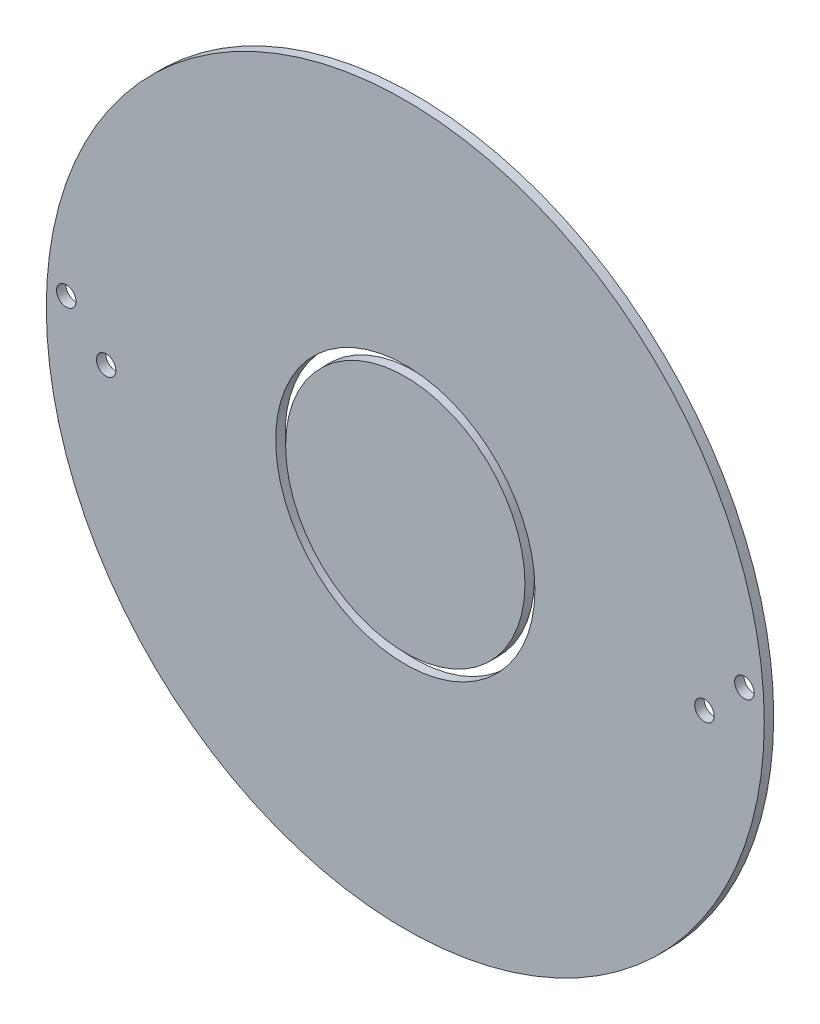
ISO-10303-21;
HEADER;
FILE_DESCRIPTION(('STEP AP214'),'2;1');
FILE_NAME('part.step','',(''),(''),'','','');
FILE_SCHEMA(('AUTOMOTIVE_DESIGN { 1 0 10303 214 1 1 1 1 }'));
ENDSEC;
DATA;
#1=APPLICATION_CONTEXT('core data for automotive mechanical design processes');
#2=APPLICATION_PROTOCOL_DEFINITION('international standard','automotive_design',2000,#1);
#3=PRODUCT_CONTEXT('',#1,'mechanical');
#4=PRODUCT('Part','Part','',(#3));
#5=PRODUCT_RELATED_PRODUCT_CATEGORY('part','',(#4));
#6=PRODUCT_DEFINITION_FORMATION('','',#4);
#7=PRODUCT_DEFINITION_CONTEXT('part definition',#1,'design');
#8=PRODUCT_DEFINITION('design','',#6,#7);
#9=PRODUCT_DEFINITION_SHAPE('','',#8);
#10=(LENGTH_UNIT() NAMED_UNIT(*) SI_UNIT(.MILLI.,.METRE.));
#11=(NAMED_UNIT(*) PLANE_ANGLE_UNIT() SI_UNIT($,.RADIAN.));
#12=(NAMED_UNIT(*) SI_UNIT($,.STERADIAN.) SOLID_ANGLE_UNIT());
#13=UNCERTAINTY_MEASURE_WITH_UNIT(LENGTH_MEASURE(1.E-05),#10,'distance_accuracy_value','');
#14=(GEOMETRIC_REPRESENTATION_CONTEXT(3) GLOBAL_UNCERTAINTY_ASSIGNED_CONTEXT((#13)) GLOBAL_UNIT_ASSIGNED_CONTEXT((#10,
#11,#12)) REPRESENTATION_CONTEXT('',''));
#15=CARTESIAN_POINT('',(0.,0.,0.));
#16=DIRECTION('',(0.,0.,1.));
#17=DIRECTION('',(1.,0.,0.));
#18=AXIS2_PLACEMENT_3D('',#15,#16,#17);
#19=CARTESIAN_POINT('',(0.,0.,0.));
#20=DIRECTION('',(0.,0.,1.));
#21=DIRECTION('',(1.,0.,0.));
#22=AXIS2_PLACEMENT_3D('',#19,#20,#21);
#23=PLANE('',#22);
#24=CARTESIAN_POINT('',(0.,0.,0.));
#25=DIRECTION('',(0.,0.,1.));
#26=DIRECTION('',(1.,0.,0.));
#27=AXIS2_PLACEMENT_3D('',#24,#25,#26);
#28=CIRCLE('',#27,19.05);
#29=CARTESIAN_POINT('',(19.05,0.,0.));
#30=VERTEX_POINT('',#29);
#31=EDGE_CURVE('E11',#30,#30,#28,.T.);
#32=ORIENTED_EDGE('',*,*,#31,.F.);
#33=EDGE_LOOP('',(#32));
#34=FACE_BOUND('',#33,.T.);
#35=ADVANCED_FACE('F35',(#34),#23,.F.);
#36=CARTESIAN_POINT('',(0.,0.,0.));
#37=DIRECTION('',(0.,0.,1.));
#38=DIRECTION('',(1.,0.,0.));
#39=AXIS2_PLACEMENT_3D('',#36,#37,#38);
#40=CYLINDRICAL_SURFACE('',#39,19.05);
#41=ORIENTED_EDGE('',*,*,#31,.T.);
#42=EDGE_LOOP('',(#41));
#43=FACE_BOUND('',#42,.T.);
#44=CARTESIAN_POINT('',(0.,0.,1.5));
#45=DIRECTION('',(0.,0.,1.));
#46=DIRECTION('',(1.,0.,0.));
#47=AXIS2_PLACEMENT_3D('',#44,#45,#46);
#48=CIRCLE('',#47,19.05);
#49=CARTESIAN_POINT('',(19.05,0.,1.5));
#50=VERTEX_POINT('',#49);
#51=EDGE_CURVE('E42',#50,#50,#48,.T.);
#52=ORIENTED_EDGE('',*,*,#51,.F.);
#53=EDGE_LOOP('',(#52));
#54=FACE_BOUND('',#53,.T.);
#55=ADVANCED_FACE('F49',(#43,#54),#40,.T.);
#56=CARTESIAN_POINT('',(0.,0.,1.5));
#57=DIRECTION('',(0.,0.,1.));
#58=DIRECTION('',(1.,0.,0.));
#59=AXIS2_PLACEMENT_3D('',#56,#57,#58);
#60=PLANE('',#59);
#61=ORIENTED_EDGE('',*,*,#51,.T.);
#62=EDGE_LOOP('',(#61));
#63=FACE_BOUND('',#62,.T.);
#64=ADVANCED_FACE('F37',(#63),#60,.T.);
#65=CLOSED_SHELL('',(#35,#55,#64));
#66=MANIFOLD_SOLID_BREP('B2',#65);
#67=CARTESIAN_POINT('',(0.,0.,1.5));
#68=DIRECTION('',(0.,0.,-1.));
#69=DIRECTION('',(-1.,0.,0.));
#70=AXIS2_PLACEMENT_3D('',#67,#68,#69);
#71=CYLINDRICAL_SURFACE('',#70,57.15);
#72=CARTESIAN_POINT('',(0.,0.,1.5));
#73=DIRECTION('',(0.,0.,1.));
#74=DIRECTION('',(1.,0.,0.));
#75=AXIS2_PLACEMENT_3D('',#72,#73,#74);
#76=CIRCLE('',#75,57.15);
#77=CARTESIAN_POINT('',(57.15,0.,1.5));
#78=VERTEX_POINT('',#77);
#79=EDGE_CURVE('E98',#78,#78,#76,.T.);
#80=ORIENTED_EDGE('',*,*,#79,.F.);
#81=EDGE_LOOP('',(#80));
#82=FACE_BOUND('',#81,.T.);
#83=CARTESIAN_POINT('',(0.,0.,0.));
#84=DIRECTION('',(0.,0.,1.));
#85=DIRECTION('',(1.,0.,0.));
#86=AXIS2_PLACEMENT_3D('',#83,#84,#85);
#87=CIRCLE('',#86,57.15);
#88=CARTESIAN_POINT('',(57.15,0.,0.));
#89=VERTEX_POINT('',#88);
#90=EDGE_CURVE('E104',#89,#89,#87,.T.);
#91=ORIENTED_EDGE('',*,*,#90,.T.);
#92=EDGE_LOOP('',(#91));
#93=FACE_BOUND('',#92,.T.);
#94=ADVANCED_FACE('F76',(#82,#93),#71,.T.);
#95=CARTESIAN_POINT('',(0.,0.,1.5));
#96=DIRECTION('',(0.,0.,1.));
#97=DIRECTION('',(1.,0.,0.));
#98=AXIS2_PLACEMENT_3D('',#95,#96,#97);
#99=PLANE('',#98);
#100=CARTESIAN_POINT('',(0.,0.,1.5));
#101=DIRECTION('',(0.,0.,1.));
#102=DIRECTION('',(1.,0.,0.));
#103=AXIS2_PLACEMENT_3D('',#100,#101,#102);
#104=CIRCLE('',#103,20.6375);
#105=CARTESIAN_POINT('',(20.6375,0.,1.5));
#106=VERTEX_POINT('',#105);
#107=EDGE_CURVE('E34',#106,#106,#104,.T.);
#108=ORIENTED_EDGE('',*,*,#107,.F.);
#109=EDGE_LOOP('',(#108));
#110=FACE_BOUND('',#109,.T.);
#111=CARTESIAN_POINT('',(47.625,-3.175,1.5));
#112=DIRECTION('',(0.,0.,1.));
#113=DIRECTION('',(1.,0.,0.));
#114=AXIS2_PLACEMENT_3D('',#111,#112,#113);
#115=CIRCLE('',#114,1.55);
#116=CARTESIAN_POINT('',(49.175,-3.175,1.5));
#117=VERTEX_POINT('',#116);
#118=EDGE_CURVE('E83',#117,#117,#115,.T.);
#119=ORIENTED_EDGE('',*,*,#118,.F.);
#120=EDGE_LOOP('',(#119));
#121=FACE_BOUND('',#120,.T.);
#122=CARTESIAN_POINT('',(53.975,3.175,1.5));
#123=DIRECTION('',(0.,0.,1.));
#124=DIRECTION('',(1.,0.,0.));
#125=AXIS2_PLACEMENT_3D('',#122,#123,#124);
#126=CIRCLE('',#125,1.55);
#127=CARTESIAN_POINT('',(55.525,3.175,1.5));
#128=VERTEX_POINT('',#127);
#129=EDGE_CURVE('E87',#128,#128,#126,.T.);
#130=ORIENTED_EDGE('',*,*,#129,.F.);
#131=EDGE_LOOP('',(#130));
#132=FACE_BOUND('',#131,.T.);
#133=CARTESIAN_POINT('',(-47.625,-3.175,1.5));
#134=DIRECTION('',(0.,0.,1.));
#135=DIRECTION('',(1.,0.,0.));
#136=AXIS2_PLACEMENT_3D('',#133,#134,#135);
#137=CIRCLE('',#136,1.55);
#138=CARTESIAN_POINT('',(-46.075,-3.175,1.5));
#139=VERTEX_POINT('',#138);
#140=EDGE_CURVE('E92',#139,#139,#137,.T.);
#141=ORIENTED_EDGE('',*,*,#140,.F.);
#142=EDGE_LOOP('',(#141));
#143=FACE_BOUND('',#142,.T.);
#144=CARTESIAN_POINT('',(-53.975,3.175,1.5));
#145=DIRECTION('',(0.,0.,1.));
#146=DIRECTION('',(1.,0.,0.));
#147=AXIS2_PLACEMENT_3D('',#144,#145,#146);
#148=CIRCLE('',#147,1.55);
#149=CARTESIAN_POINT('',(-52.425,3.175,1.5));
#150=VERTEX_POINT('',#149);
#151=EDGE_CURVE('E114',#150,#150,#148,.T.);
#152=ORIENTED_EDGE('',*,*,#151,.F.);
#153=EDGE_LOOP('',(#152));
#154=FACE_BOUND('',#153,.T.);
#155=ORIENTED_EDGE('',*,*,#79,.T.);
#156=EDGE_LOOP('',(#155));
#157=FACE_BOUND('',#156,.T.);
#158=ADVANCED_FACE('F78',(#110,#121,#132,#143,#154,#157),#99,.T.);
#159=CARTESIAN_POINT('',(0.,0.,0.));
#160=DIRECTION('',(0.,0.,1.));
#161=DIRECTION('',(1.,0.,0.));
#162=AXIS2_PLACEMENT_3D('',#159,#160,#161);
#163=PLANE('',#162);
#164=CARTESIAN_POINT('',(0.,0.,0.));
#165=DIRECTION('',(0.,0.,1.));
#166=DIRECTION('',(1.,0.,0.));
#167=AXIS2_PLACEMENT_3D('',#164,#165,#166);
#168=CIRCLE('',#167,20.6375);
#169=CARTESIAN_POINT('',(20.6375,0.,0.));
#170=VERTEX_POINT('',#169);
#171=EDGE_CURVE('E96',#170,#170,#168,.T.);
#172=ORIENTED_EDGE('',*,*,#171,.T.);
#173=EDGE_LOOP('',(#172));
#174=FACE_BOUND('',#173,.T.);
#175=CARTESIAN_POINT('',(47.625,-3.175,0.));
#176=DIRECTION('',(0.,0.,1.));
#177=DIRECTION('',(1.,0.,0.));
#178=AXIS2_PLACEMENT_3D('',#175,#176,#177);
#179=CIRCLE('',#178,1.55);
#180=CARTESIAN_POINT('',(49.175,-3.175,0.));
#181=VERTEX_POINT('',#180);
#182=EDGE_CURVE('E95',#181,#181,#179,.T.);
#183=ORIENTED_EDGE('',*,*,#182,.T.);
#184=EDGE_LOOP('',(#183));
#185=FACE_BOUND('',#184,.T.);
#186=CARTESIAN_POINT('',(53.975,3.175,0.));
#187=DIRECTION('',(0.,0.,1.));
#188=DIRECTION('',(1.,0.,0.));
#189=AXIS2_PLACEMENT_3D('',#186,#187,#188);
#190=CIRCLE('',#189,1.55);
#191=CARTESIAN_POINT('',(55.525,3.175,0.));
#192=VERTEX_POINT('',#191);
#193=EDGE_CURVE('E102',#192,#192,#190,.T.);
#194=ORIENTED_EDGE('',*,*,#193,.T.);
#195=EDGE_LOOP('',(#194));
#196=FACE_BOUND('',#195,.T.);
#197=CARTESIAN_POINT('',(-47.625,-3.175,0.));
#198=DIRECTION('',(0.,0.,1.));
#199=DIRECTION('',(1.,0.,0.));
#200=AXIS2_PLACEMENT_3D('',#197,#198,#199);
#201=CIRCLE('',#200,1.55);
#202=CARTESIAN_POINT('',(-46.075,-3.175,0.));
#203=VERTEX_POINT('',#202);
#204=EDGE_CURVE('E115',#203,#203,#201,.T.);
#205=ORIENTED_EDGE('',*,*,#204,.T.);
#206=EDGE_LOOP('',(#205));
#207=FACE_BOUND('',#206,.T.);
#208=CARTESIAN_POINT('',(-53.975,3.175,0.));
#209=DIRECTION('',(0.,0.,1.));
#210=DIRECTION('',(1.,0.,0.));
#211=AXIS2_PLACEMENT_3D('',#208,#209,#210);
#212=CIRCLE('',#211,1.55);
#213=CARTESIAN_POINT('',(-52.425,3.175,0.));
#214=VERTEX_POINT('',#213);
#215=EDGE_CURVE('E111',#214,#214,#212,.T.);
#216=ORIENTED_EDGE('',*,*,#215,.T.);
#217=EDGE_LOOP('',(#216));
#218=FACE_BOUND('',#217,.T.);
#219=ORIENTED_EDGE('',*,*,#90,.F.);
#220=EDGE_LOOP('',(#219));
#221=FACE_BOUND('',#220,.T.);
#222=ADVANCED_FACE('F125',(#174,#185,#196,#207,#218,#221),#163,.F.);
#223=CARTESIAN_POINT('',(-53.975,3.175,0.));
#224=DIRECTION('',(0.,0.,1.));
#225=DIRECTION('',(1.,0.,0.));
#226=AXIS2_PLACEMENT_3D('',#223,#224,#225);
#227=CYLINDRICAL_SURFACE('',#226,1.55);
#228=ORIENTED_EDGE('',*,*,#215,.F.);
#229=EDGE_LOOP('',(#228));
#230=FACE_BOUND('',#229,.T.);
#231=ORIENTED_EDGE('',*,*,#151,.T.);
#232=EDGE_LOOP('',(#231));
#233=FACE_BOUND('',#232,.T.);
#234=ADVANCED_FACE('F143',(#230,#233),#227,.F.);
#235=CARTESIAN_POINT('',(-47.625,-3.175,0.));
#236=DIRECTION('',(0.,0.,1.));
#237=DIRECTION('',(1.,0.,0.));
#238=AXIS2_PLACEMENT_3D('',#235,#236,#237);
#239=CYLINDRICAL_SURFACE('',#238,1.55);
#240=ORIENTED_EDGE('',*,*,#204,.F.);
#241=EDGE_LOOP('',(#240));
#242=FACE_BOUND('',#241,.T.);
#243=ORIENTED_EDGE('',*,*,#140,.T.);
#244=EDGE_LOOP('',(#243));
#245=FACE_BOUND('',#244,.T.);
#246=ADVANCED_FACE('F132',(#242,#245),#239,.F.);
#247=CARTESIAN_POINT('',(53.975,3.175,0.));
#248=DIRECTION('',(0.,0.,1.));
#249=DIRECTION('',(1.,0.,0.));
#250=AXIS2_PLACEMENT_3D('',#247,#248,#249);
#251=CYLINDRICAL_SURFACE('',#250,1.55);
#252=ORIENTED_EDGE('',*,*,#193,.F.);
#253=EDGE_LOOP('',(#252));
#254=FACE_BOUND('',#253,.T.);
#255=ORIENTED_EDGE('',*,*,#129,.T.);
#256=EDGE_LOOP('',(#255));
#257=FACE_BOUND('',#256,.T.);
#258=ADVANCED_FACE('F128',(#254,#257),#251,.F.);
#259=CARTESIAN_POINT('',(47.625,-3.175,0.));
#260=DIRECTION('',(0.,0.,1.));
#261=DIRECTION('',(1.,0.,0.));
#262=AXIS2_PLACEMENT_3D('',#259,#260,#261);
#263=CYLINDRICAL_SURFACE('',#262,1.55);
#264=ORIENTED_EDGE('',*,*,#182,.F.);
#265=EDGE_LOOP('',(#264));
#266=FACE_BOUND('',#265,.T.);
#267=ORIENTED_EDGE('',*,*,#118,.T.);
#268=EDGE_LOOP('',(#267));
#269=FACE_BOUND('',#268,.T.);
#270=ADVANCED_FACE('F131',(#266,#269),#263,.F.);
#271=CARTESIAN_POINT('',(0.,0.,0.));
#272=DIRECTION('',(0.,0.,1.));
#273=DIRECTION('',(1.,0.,0.));
#274=AXIS2_PLACEMENT_3D('',#271,#272,#273);
#275=CYLINDRICAL_SURFACE('',#274,20.6375);
#276=ORIENTED_EDGE('',*,*,#171,.F.);
#277=EDGE_LOOP('',(#276));
#278=FACE_BOUND('',#277,.T.);
#279=ORIENTED_EDGE('',*,*,#107,.T.);
#280=EDGE_LOOP('',(#279));
#281=FACE_BOUND('',#280,.T.);
#282=ADVANCED_FACE('F195',(#278,#281),#275,.F.);
#283=CLOSED_SHELL('',(#94,#158,#222,#234,#246,#258,#270,#282));
#284=MANIFOLD_SOLID_BREP('B6',#283);
#285=ADVANCED_BREP_SHAPE_REPRESENTATION('',(#18,#66,#284),#14);
#286=SHAPE_DEFINITION_REPRESENTATION(#9,#285);
ENDSEC;
END-ISO-10303-21;
